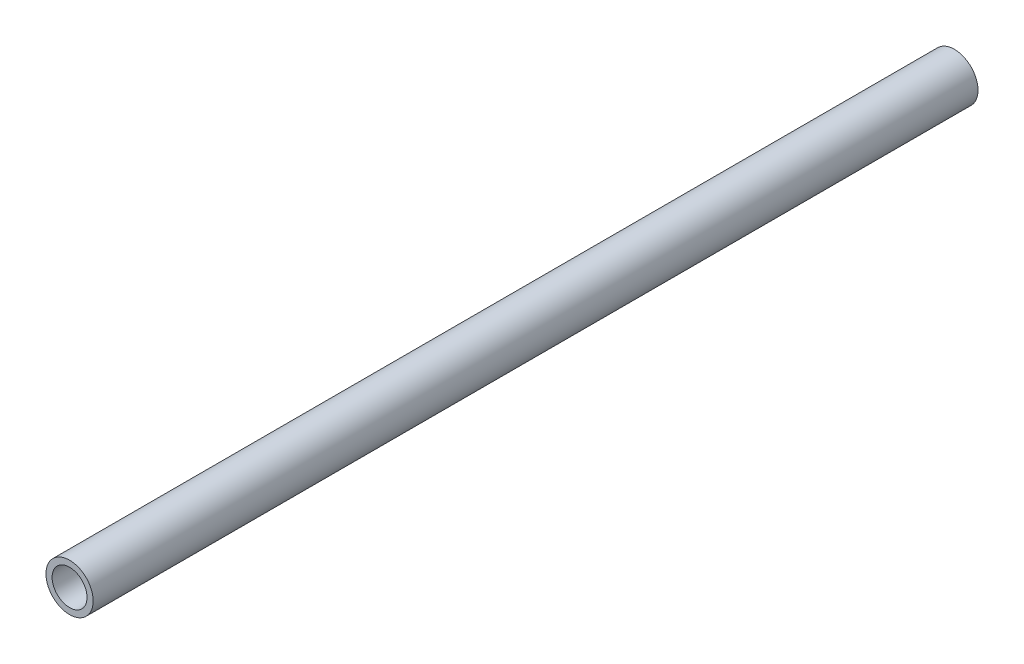
ISO-10303-21;
HEADER;
FILE_DESCRIPTION(('STEP AP214'),'2;1');
FILE_NAME('part.step','',(''),(''),'','','');
FILE_SCHEMA(('AUTOMOTIVE_DESIGN { 1 0 10303 214 1 1 1 1 }'));
ENDSEC;
DATA;
#1=APPLICATION_CONTEXT('core data for automotive mechanical design processes');
#2=APPLICATION_PROTOCOL_DEFINITION('international standard','automotive_design',2000,#1);
#3=PRODUCT_CONTEXT('',#1,'mechanical');
#4=PRODUCT('Part','Part','',(#3));
#5=PRODUCT_RELATED_PRODUCT_CATEGORY('part','',(#4));
#6=PRODUCT_DEFINITION_FORMATION('','',#4);
#7=PRODUCT_DEFINITION_CONTEXT('part definition',#1,'design');
#8=PRODUCT_DEFINITION('design','',#6,#7);
#9=PRODUCT_DEFINITION_SHAPE('','',#8);
#10=(LENGTH_UNIT() NAMED_UNIT(*) SI_UNIT(.MILLI.,.METRE.));
#11=(NAMED_UNIT(*) PLANE_ANGLE_UNIT() SI_UNIT($,.RADIAN.));
#12=(NAMED_UNIT(*) SI_UNIT($,.STERADIAN.) SOLID_ANGLE_UNIT());
#13=UNCERTAINTY_MEASURE_WITH_UNIT(LENGTH_MEASURE(1.E-05),#10,'distance_accuracy_value','');
#14=(GEOMETRIC_REPRESENTATION_CONTEXT(3) GLOBAL_UNCERTAINTY_ASSIGNED_CONTEXT((#13)) GLOBAL_UNIT_ASSIGNED_CONTEXT((#10,
#11,#12)) REPRESENTATION_CONTEXT('',''));
#15=CARTESIAN_POINT('',(0.,0.,0.));
#16=DIRECTION('',(0.,0.,1.));
#17=DIRECTION('',(1.,0.,0.));
#18=AXIS2_PLACEMENT_3D('',#15,#16,#17);
#19=CARTESIAN_POINT('',(0.,0.,200.));
#20=DIRECTION('',(0.,0.,1.));
#21=DIRECTION('',(1.,0.,0.));
#22=AXIS2_PLACEMENT_3D('',#19,#20,#21);
#23=PLANE('',#22);
#24=CARTESIAN_POINT('',(0.,0.,200.));
#25=DIRECTION('',(0.,0.,1.));
#26=DIRECTION('',(1.,0.,0.));
#27=AXIS2_PLACEMENT_3D('',#24,#25,#26);
#28=CIRCLE('',#27,10.668);
#29=CARTESIAN_POINT('',(10.668,0.,200.));
#30=VERTEX_POINT('',#29);
#31=EDGE_CURVE('E11',#30,#30,#28,.T.);
#32=ORIENTED_EDGE('',*,*,#31,.T.);
#33=EDGE_LOOP('',(#32));
#34=FACE_BOUND('',#33,.T.);
#35=CARTESIAN_POINT('',(0.,0.,200.));
#36=DIRECTION('',(0.,0.,1.));
#37=DIRECTION('',(1.,0.,0.));
#38=AXIS2_PLACEMENT_3D('',#35,#36,#37);
#39=CIRCLE('',#38,7.8994);
#40=CARTESIAN_POINT('',(7.8994,0.,200.));
#41=VERTEX_POINT('',#40);
#42=EDGE_CURVE('E56',#41,#41,#39,.T.);
#43=ORIENTED_EDGE('',*,*,#42,.F.);
#44=EDGE_LOOP('',(#43));
#45=FACE_BOUND('',#44,.T.);
#46=ADVANCED_FACE('F43',(#34,#45),#23,.T.);
#47=CARTESIAN_POINT('',(0.,0.,-200.));
#48=DIRECTION('',(0.,0.,1.));
#49=DIRECTION('',(1.,0.,0.));
#50=AXIS2_PLACEMENT_3D('',#47,#48,#49);
#51=PLANE('',#50);
#52=CARTESIAN_POINT('',(0.,0.,-200.));
#53=DIRECTION('',(0.,0.,1.));
#54=DIRECTION('',(1.,0.,0.));
#55=AXIS2_PLACEMENT_3D('',#52,#53,#54);
#56=CIRCLE('',#55,10.668);
#57=CARTESIAN_POINT('',(10.668,0.,-200.));
#58=VERTEX_POINT('',#57);
#59=EDGE_CURVE('E47',#58,#58,#56,.T.);
#60=ORIENTED_EDGE('',*,*,#59,.F.);
#61=EDGE_LOOP('',(#60));
#62=FACE_BOUND('',#61,.T.);
#63=CARTESIAN_POINT('',(0.,0.,-200.));
#64=DIRECTION('',(0.,0.,1.));
#65=DIRECTION('',(1.,0.,0.));
#66=AXIS2_PLACEMENT_3D('',#63,#64,#65);
#67=CIRCLE('',#66,7.8994);
#68=CARTESIAN_POINT('',(7.8994,0.,-200.));
#69=VERTEX_POINT('',#68);
#70=EDGE_CURVE('E58',#69,#69,#67,.T.);
#71=ORIENTED_EDGE('',*,*,#70,.T.);
#72=EDGE_LOOP('',(#71));
#73=FACE_BOUND('',#72,.T.);
#74=ADVANCED_FACE('F70',(#62,#73),#51,.F.);
#75=CARTESIAN_POINT('',(0.,0.,200.));
#76=DIRECTION('',(0.,0.,-1.));
#77=DIRECTION('',(-1.,0.,0.));
#78=AXIS2_PLACEMENT_3D('',#75,#76,#77);
#79=CYLINDRICAL_SURFACE('',#78,10.668);
#80=ORIENTED_EDGE('',*,*,#31,.F.);
#81=EDGE_LOOP('',(#80));
#82=FACE_BOUND('',#81,.T.);
#83=ORIENTED_EDGE('',*,*,#59,.T.);
#84=EDGE_LOOP('',(#83));
#85=FACE_BOUND('',#84,.T.);
#86=ADVANCED_FACE('F45',(#82,#85),#79,.T.);
#87=CARTESIAN_POINT('',(0.,0.,200.));
#88=DIRECTION('',(0.,0.,-1.));
#89=DIRECTION('',(-1.,0.,0.));
#90=AXIS2_PLACEMENT_3D('',#87,#88,#89);
#91=CYLINDRICAL_SURFACE('',#90,7.8994);
#92=ORIENTED_EDGE('',*,*,#42,.T.);
#93=EDGE_LOOP('',(#92));
#94=FACE_BOUND('',#93,.T.);
#95=ORIENTED_EDGE('',*,*,#70,.F.);
#96=EDGE_LOOP('',(#95));
#97=FACE_BOUND('',#96,.T.);
#98=ADVANCED_FACE('F66',(#94,#97),#91,.F.);
#99=CLOSED_SHELL('',(#46,#74,#86,#98));
#100=MANIFOLD_SOLID_BREP('B2',#99);
#101=ADVANCED_BREP_SHAPE_REPRESENTATION('',(#18,#100),#14);
#102=SHAPE_DEFINITION_REPRESENTATION(#9,#101);
ENDSEC;
END-ISO-10303-21;
